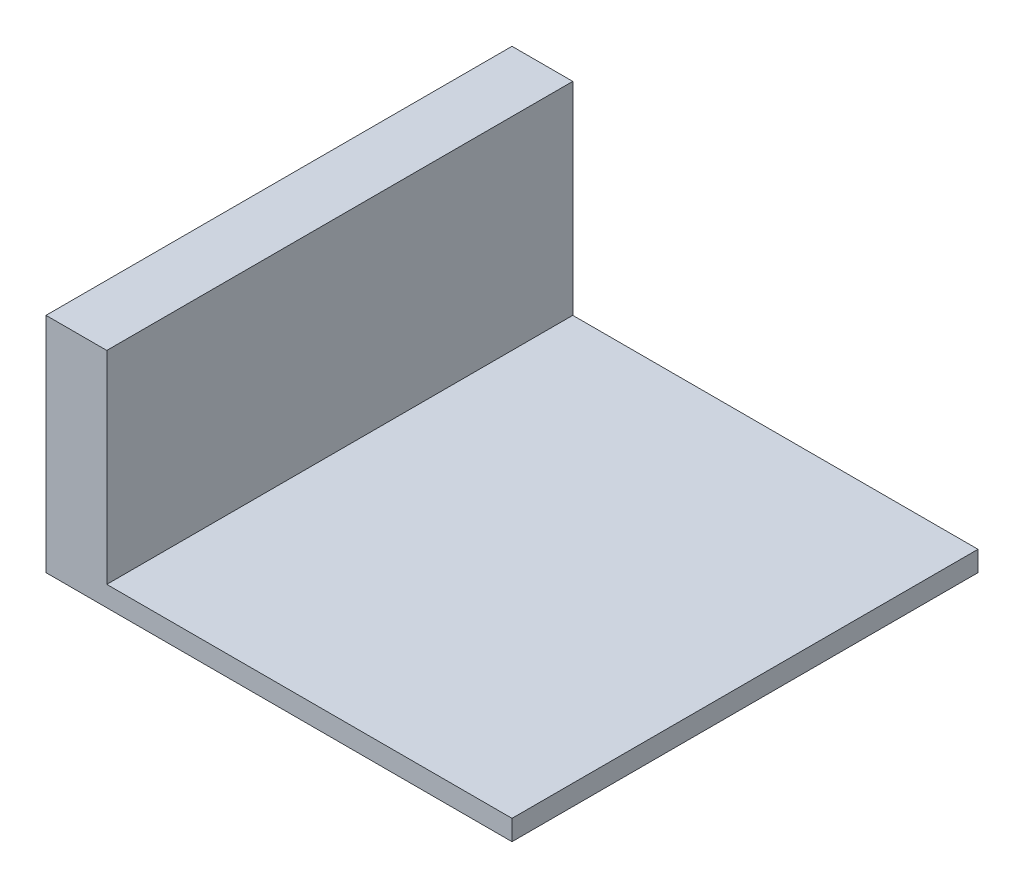
ISO-10303-21;
HEADER;
FILE_DESCRIPTION(('STEP AP214'),'2;1');
FILE_NAME('part.step','',(''),(''),'','','');
FILE_SCHEMA(('AUTOMOTIVE_DESIGN { 1 0 10303 214 1 1 1 1 }'));
ENDSEC;
DATA;
#1=APPLICATION_CONTEXT('core data for automotive mechanical design processes');
#2=APPLICATION_PROTOCOL_DEFINITION('international standard','automotive_design',2000,#1);
#3=PRODUCT_CONTEXT('',#1,'mechanical');
#4=PRODUCT('Part','Part','',(#3));
#5=PRODUCT_RELATED_PRODUCT_CATEGORY('part','',(#4));
#6=PRODUCT_DEFINITION_FORMATION('','',#4);
#7=PRODUCT_DEFINITION_CONTEXT('part definition',#1,'design');
#8=PRODUCT_DEFINITION('design','',#6,#7);
#9=PRODUCT_DEFINITION_SHAPE('','',#8);
#10=(LENGTH_UNIT() NAMED_UNIT(*) SI_UNIT(.MILLI.,.METRE.));
#11=(NAMED_UNIT(*) PLANE_ANGLE_UNIT() SI_UNIT($,.RADIAN.));
#12=(NAMED_UNIT(*) SI_UNIT($,.STERADIAN.) SOLID_ANGLE_UNIT());
#13=UNCERTAINTY_MEASURE_WITH_UNIT(LENGTH_MEASURE(1.E-05),#10,'distance_accuracy_value','');
#14=(GEOMETRIC_REPRESENTATION_CONTEXT(3) GLOBAL_UNCERTAINTY_ASSIGNED_CONTEXT((#13)) GLOBAL_UNIT_ASSIGNED_CONTEXT((#10,
#11,#12)) REPRESENTATION_CONTEXT('',''));
#15=CARTESIAN_POINT('',(0.,0.,0.));
#16=DIRECTION('',(0.,0.,1.));
#17=DIRECTION('',(1.,0.,0.));
#18=AXIS2_PLACEMENT_3D('',#15,#16,#17);
#19=CARTESIAN_POINT('',(-36.4898729141216,10.,-17.7501176470588));
#20=DIRECTION('',(1.,0.,0.));
#21=DIRECTION('',(0.,0.,-1.));
#22=AXIS2_PLACEMENT_3D('',#19,#20,#21);
#23=PLANE('',#22);
#24=DIRECTION('',(0.,-1.,0.));
#25=VECTOR('',#24,1.);
#26=CARTESIAN_POINT('',(-36.4898729141216,10.,-20.7501176470588));
#27=LINE('',#26,#25);
#28=CARTESIAN_POINT('',(-36.4898729141216,10.,-20.7501176470588));
#29=VERTEX_POINT('',#28);
#30=CARTESIAN_POINT('',(-36.4898729141216,-1.,-20.7501176470588));
#31=VERTEX_POINT('',#30);
#32=EDGE_CURVE('E79',#29,#31,#27,.T.);
#33=ORIENTED_EDGE('',*,*,#32,.T.);
#34=DIRECTION('',(0.,0.,-1.));
#35=VECTOR('',#34,1.);
#36=CARTESIAN_POINT('',(-36.4898729141216,-1.,2.24988235294117));
#37=LINE('',#36,#35);
#38=CARTESIAN_POINT('',(-36.4898729141216,-1.,2.24988235294117));
#39=VERTEX_POINT('',#38);
#40=EDGE_CURVE('E83',#39,#31,#37,.T.);
#41=ORIENTED_EDGE('',*,*,#40,.F.);
#42=DIRECTION('',(0.,-1.,0.));
#43=VECTOR('',#42,1.);
#44=CARTESIAN_POINT('',(-36.4898729141216,10.,2.24988235294117));
#45=LINE('',#44,#43);
#46=CARTESIAN_POINT('',(-36.4898729141216,10.,2.24988235294117));
#47=VERTEX_POINT('',#46);
#48=EDGE_CURVE('E11',#47,#39,#45,.T.);
#49=ORIENTED_EDGE('',*,*,#48,.F.);
#50=DIRECTION('',(0.,0.,1.));
#51=VECTOR('',#50,1.);
#52=CARTESIAN_POINT('',(-36.4898729141216,10.,-20.7501176470588));
#53=LINE('',#52,#51);
#54=EDGE_CURVE('E84',#29,#47,#53,.T.);
#55=ORIENTED_EDGE('',*,*,#54,.F.);
#56=EDGE_LOOP('',(#33,#41,#49,#55));
#57=FACE_BOUND('',#56,.T.);
#58=ADVANCED_FACE('F33',(#57),#23,.F.);
#59=CARTESIAN_POINT('',(-36.4898729141216,10.,2.24988235294117));
#60=DIRECTION('',(0.,0.,-1.));
#61=DIRECTION('',(-1.,0.,0.));
#62=AXIS2_PLACEMENT_3D('',#59,#60,#61);
#63=PLANE('',#62);
#64=ORIENTED_EDGE('',*,*,#48,.T.);
#65=DIRECTION('',(-1.,0.,0.));
#66=VECTOR('',#65,1.);
#67=CARTESIAN_POINT('',(-36.4898729141216,-1.,2.24988235294117));
#68=LINE('',#67,#66);
#69=CARTESIAN_POINT('',(-13.4898729141216,-1.,2.24988235294117));
#70=VERTEX_POINT('',#69);
#71=EDGE_CURVE('E101',#70,#39,#68,.T.);
#72=ORIENTED_EDGE('',*,*,#71,.F.);
#73=DIRECTION('',(0.,1.,0.));
#74=VECTOR('',#73,1.);
#75=CARTESIAN_POINT('',(-13.4898729141216,-1.,2.24988235294117));
#76=LINE('',#75,#74);
#77=CARTESIAN_POINT('',(-13.4898729141216,0.,2.24988235294117));
#78=VERTEX_POINT('',#77);
#79=EDGE_CURVE('E110',#70,#78,#76,.T.);
#80=ORIENTED_EDGE('',*,*,#79,.T.);
#81=DIRECTION('',(-1.,0.,0.));
#82=VECTOR('',#81,1.);
#83=CARTESIAN_POINT('',(-36.4898729141216,0.,2.24988235294117));
#84=LINE('',#83,#82);
#85=CARTESIAN_POINT('',(-33.4898729141216,0.,2.24988235294117));
#86=VERTEX_POINT('',#85);
#87=EDGE_CURVE('E102',#78,#86,#84,.T.);
#88=ORIENTED_EDGE('',*,*,#87,.T.);
#89=DIRECTION('',(0.,-1.,0.));
#90=VECTOR('',#89,1.);
#91=CARTESIAN_POINT('',(-33.4898729141216,10.,2.24988235294117));
#92=LINE('',#91,#90);
#93=CARTESIAN_POINT('',(-33.4898729141216,10.,2.24988235294117));
#94=VERTEX_POINT('',#93);
#95=EDGE_CURVE('E41',#94,#86,#92,.T.);
#96=ORIENTED_EDGE('',*,*,#95,.F.);
#97=DIRECTION('',(1.,0.,0.));
#98=VECTOR('',#97,1.);
#99=CARTESIAN_POINT('',(-36.4898729141216,10.,2.24988235294117));
#100=LINE('',#99,#98);
#101=EDGE_CURVE('E119',#47,#94,#100,.T.);
#102=ORIENTED_EDGE('',*,*,#101,.F.);
#103=EDGE_LOOP('',(#64,#72,#80,#88,#96,#102));
#104=FACE_BOUND('',#103,.T.);
#105=ADVANCED_FACE('F134',(#104),#63,.F.);
#106=CARTESIAN_POINT('',(-33.4898729141216,10.,-0.750117647058833));
#107=DIRECTION('',(-1.,0.,0.));
#108=DIRECTION('',(0.,0.,1.));
#109=AXIS2_PLACEMENT_3D('',#106,#107,#108);
#110=PLANE('',#109);
#111=DIRECTION('',(0.,0.,-1.));
#112=VECTOR('',#111,1.);
#113=CARTESIAN_POINT('',(-33.4898729141216,0.,-0.750117647058833));
#114=LINE('',#113,#112);
#115=CARTESIAN_POINT('',(-33.4898729141216,0.,-20.7501176470588));
#116=VERTEX_POINT('',#115);
#117=EDGE_CURVE('E117',#86,#116,#114,.T.);
#118=ORIENTED_EDGE('',*,*,#117,.T.);
#119=DIRECTION('',(0.,-1.,0.));
#120=VECTOR('',#119,1.);
#121=CARTESIAN_POINT('',(-33.4898729141216,10.,-20.7501176470588));
#122=LINE('',#121,#120);
#123=CARTESIAN_POINT('',(-33.4898729141216,10.,-20.7501176470588));
#124=VERTEX_POINT('',#123);
#125=EDGE_CURVE('E86',#124,#116,#122,.T.);
#126=ORIENTED_EDGE('',*,*,#125,.F.);
#127=DIRECTION('',(0.,0.,-1.));
#128=VECTOR('',#127,1.);
#129=CARTESIAN_POINT('',(-33.4898729141216,10.,-0.750117647058833));
#130=LINE('',#129,#128);
#131=EDGE_CURVE('E121',#94,#124,#130,.T.);
#132=ORIENTED_EDGE('',*,*,#131,.F.);
#133=ORIENTED_EDGE('',*,*,#95,.T.);
#134=EDGE_LOOP('',(#118,#126,#132,#133));
#135=FACE_BOUND('',#134,.T.);
#136=ADVANCED_FACE('F130',(#135),#110,.F.);
#137=CARTESIAN_POINT('',(-33.4898729141216,10.,-20.7501176470588));
#138=DIRECTION('',(0.,0.,1.));
#139=DIRECTION('',(1.,0.,0.));
#140=AXIS2_PLACEMENT_3D('',#137,#138,#139);
#141=PLANE('',#140);
#142=ORIENTED_EDGE('',*,*,#125,.T.);
#143=DIRECTION('',(1.,0.,0.));
#144=VECTOR('',#143,1.);
#145=CARTESIAN_POINT('',(-36.4898729141216,0.,-20.7501176470588));
#146=LINE('',#145,#144);
#147=CARTESIAN_POINT('',(-13.4898729141216,0.,-20.7501176470588));
#148=VERTEX_POINT('',#147);
#149=EDGE_CURVE('E111',#116,#148,#146,.T.);
#150=ORIENTED_EDGE('',*,*,#149,.T.);
#151=DIRECTION('',(0.,1.,0.));
#152=VECTOR('',#151,1.);
#153=CARTESIAN_POINT('',(-13.4898729141216,-1.,-20.7501176470588));
#154=LINE('',#153,#152);
#155=CARTESIAN_POINT('',(-13.4898729141216,-1.,-20.7501176470588));
#156=VERTEX_POINT('',#155);
#157=EDGE_CURVE('E93',#156,#148,#154,.T.);
#158=ORIENTED_EDGE('',*,*,#157,.F.);
#159=DIRECTION('',(1.,0.,0.));
#160=VECTOR('',#159,1.);
#161=CARTESIAN_POINT('',(-36.4898729141216,-1.,-20.7501176470588));
#162=LINE('',#161,#160);
#163=EDGE_CURVE('E89',#31,#156,#162,.T.);
#164=ORIENTED_EDGE('',*,*,#163,.F.);
#165=ORIENTED_EDGE('',*,*,#32,.F.);
#166=DIRECTION('',(-1.,0.,0.));
#167=VECTOR('',#166,1.);
#168=CARTESIAN_POINT('',(-33.4898729141216,10.,-20.7501176470588));
#169=LINE('',#168,#167);
#170=EDGE_CURVE('E48',#124,#29,#169,.T.);
#171=ORIENTED_EDGE('',*,*,#170,.F.);
#172=EDGE_LOOP('',(#142,#150,#158,#164,#165,#171));
#173=FACE_BOUND('',#172,.T.);
#174=ADVANCED_FACE('F91',(#173),#141,.F.);
#175=CARTESIAN_POINT('',(0.,10.,0.));
#176=DIRECTION('',(0.,1.,0.));
#177=DIRECTION('',(0.,0.,1.));
#178=AXIS2_PLACEMENT_3D('',#175,#176,#177);
#179=PLANE('',#178);
#180=ORIENTED_EDGE('',*,*,#54,.T.);
#181=ORIENTED_EDGE('',*,*,#101,.T.);
#182=ORIENTED_EDGE('',*,*,#131,.T.);
#183=ORIENTED_EDGE('',*,*,#170,.T.);
#184=EDGE_LOOP('',(#180,#181,#182,#183));
#185=FACE_BOUND('',#184,.T.);
#186=ADVANCED_FACE('F144',(#185),#179,.T.);
#187=CARTESIAN_POINT('',(-13.4898729141216,-1.,2.24988235294117));
#188=DIRECTION('',(-1.,0.,0.));
#189=DIRECTION('',(0.,0.,1.));
#190=AXIS2_PLACEMENT_3D('',#187,#188,#189);
#191=PLANE('',#190);
#192=DIRECTION('',(0.,0.,1.));
#193=VECTOR('',#192,1.);
#194=CARTESIAN_POINT('',(-13.4898729141216,0.,2.24988235294117));
#195=LINE('',#194,#193);
#196=EDGE_CURVE('E105',#148,#78,#195,.T.);
#197=ORIENTED_EDGE('',*,*,#196,.T.);
#198=ORIENTED_EDGE('',*,*,#79,.F.);
#199=DIRECTION('',(0.,0.,1.));
#200=VECTOR('',#199,1.);
#201=CARTESIAN_POINT('',(-13.4898729141216,-1.,2.24988235294117));
#202=LINE('',#201,#200);
#203=EDGE_CURVE('E96',#156,#70,#202,.T.);
#204=ORIENTED_EDGE('',*,*,#203,.F.);
#205=ORIENTED_EDGE('',*,*,#157,.T.);
#206=EDGE_LOOP('',(#197,#198,#204,#205));
#207=FACE_BOUND('',#206,.T.);
#208=ADVANCED_FACE('F142',(#207),#191,.F.);
#209=CARTESIAN_POINT('',(0.,-1.,0.));
#210=DIRECTION('',(0.,-1.,0.));
#211=DIRECTION('',(0.,0.,-1.));
#212=AXIS2_PLACEMENT_3D('',#209,#210,#211);
#213=PLANE('',#212);
#214=ORIENTED_EDGE('',*,*,#40,.T.);
#215=ORIENTED_EDGE('',*,*,#163,.T.);
#216=ORIENTED_EDGE('',*,*,#203,.T.);
#217=ORIENTED_EDGE('',*,*,#71,.T.);
#218=EDGE_LOOP('',(#214,#215,#216,#217));
#219=FACE_BOUND('',#218,.T.);
#220=ADVANCED_FACE('F99',(#219),#213,.T.);
#221=CARTESIAN_POINT('',(0.,0.,0.));
#222=DIRECTION('',(0.,-1.,0.));
#223=DIRECTION('',(0.,0.,-1.));
#224=AXIS2_PLACEMENT_3D('',#221,#222,#223);
#225=PLANE('',#224);
#226=ORIENTED_EDGE('',*,*,#117,.F.);
#227=ORIENTED_EDGE('',*,*,#87,.F.);
#228=ORIENTED_EDGE('',*,*,#196,.F.);
#229=ORIENTED_EDGE('',*,*,#149,.F.);
#230=EDGE_LOOP('',(#226,#227,#228,#229));
#231=FACE_BOUND('',#230,.T.);
#232=ADVANCED_FACE('F139',(#231),#225,.F.);
#233=CLOSED_SHELL('',(#58,#105,#136,#174,#186,#208,#220,#232));
#234=MANIFOLD_SOLID_BREP('B2',#233);
#235=ADVANCED_BREP_SHAPE_REPRESENTATION('',(#18,#234),#14);
#236=SHAPE_DEFINITION_REPRESENTATION(#9,#235);
ENDSEC;
END-ISO-10303-21;
